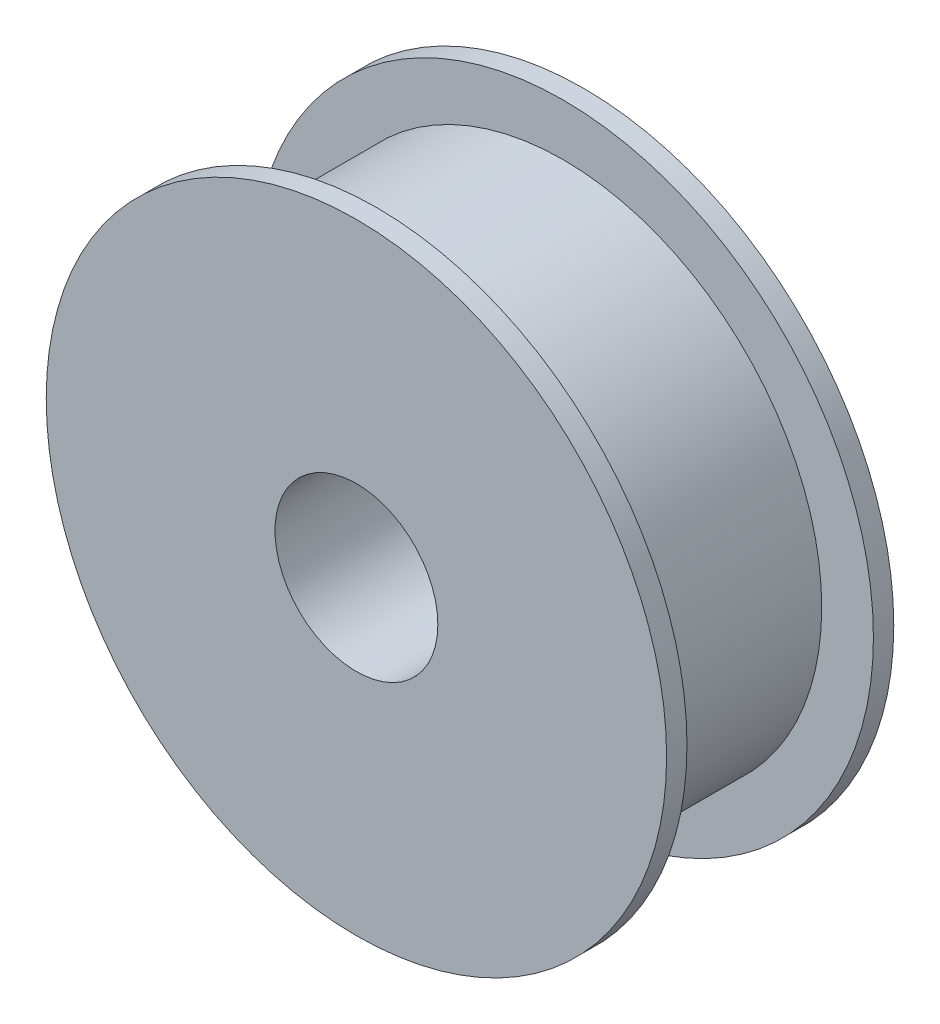
ISO-10303-21;
HEADER;
FILE_DESCRIPTION(('STEP AP214'),'2;1');
FILE_NAME('part.step','',(''),(''),'','','');
FILE_SCHEMA(('AUTOMOTIVE_DESIGN { 1 0 10303 214 1 1 1 1 }'));
ENDSEC;
DATA;
#1=APPLICATION_CONTEXT('core data for automotive mechanical design processes');
#2=APPLICATION_PROTOCOL_DEFINITION('international standard','automotive_design',2000,#1);
#3=PRODUCT_CONTEXT('',#1,'mechanical');
#4=PRODUCT('Part','Part','',(#3));
#5=PRODUCT_RELATED_PRODUCT_CATEGORY('part','',(#4));
#6=PRODUCT_DEFINITION_FORMATION('','',#4);
#7=PRODUCT_DEFINITION_CONTEXT('part definition',#1,'design');
#8=PRODUCT_DEFINITION('design','',#6,#7);
#9=PRODUCT_DEFINITION_SHAPE('','',#8);
#10=(LENGTH_UNIT() NAMED_UNIT(*) SI_UNIT(.MILLI.,.METRE.));
#11=(NAMED_UNIT(*) PLANE_ANGLE_UNIT() SI_UNIT($,.RADIAN.));
#12=(NAMED_UNIT(*) SI_UNIT($,.STERADIAN.) SOLID_ANGLE_UNIT());
#13=UNCERTAINTY_MEASURE_WITH_UNIT(LENGTH_MEASURE(1.E-05),#10,'distance_accuracy_value','');
#14=(GEOMETRIC_REPRESENTATION_CONTEXT(3) GLOBAL_UNCERTAINTY_ASSIGNED_CONTEXT((#13)) GLOBAL_UNIT_ASSIGNED_CONTEXT((#10,
#11,#12)) REPRESENTATION_CONTEXT('',''));
#15=CARTESIAN_POINT('',(0.,0.,0.));
#16=DIRECTION('',(0.,0.,1.));
#17=DIRECTION('',(1.,0.,0.));
#18=AXIS2_PLACEMENT_3D('',#15,#16,#17);
#19=CARTESIAN_POINT('',(0.,0.,50.8));
#20=DIRECTION('',(0.,0.,-1.));
#21=DIRECTION('',(-1.,0.,0.));
#22=AXIS2_PLACEMENT_3D('',#19,#20,#21);
#23=CYLINDRICAL_SURFACE('',#22,63.5);
#24=CARTESIAN_POINT('',(0.,0.,50.8));
#25=DIRECTION('',(0.,0.,1.));
#26=DIRECTION('',(1.,0.,0.));
#27=AXIS2_PLACEMENT_3D('',#24,#25,#26);
#28=CIRCLE('',#27,63.5);
#29=CARTESIAN_POINT('',(63.5,0.,50.8));
#30=VERTEX_POINT('',#29);
#31=EDGE_CURVE('E184',#30,#30,#28,.T.);
#32=ORIENTED_EDGE('',*,*,#31,.F.);
#33=EDGE_LOOP('',(#32));
#34=FACE_BOUND('',#33,.T.);
#35=CARTESIAN_POINT('',(0.,0.,5.));
#36=DIRECTION('',(0.,0.,1.));
#37=DIRECTION('',(1.,0.,0.));
#38=AXIS2_PLACEMENT_3D('',#35,#36,#37);
#39=CIRCLE('',#38,63.5);
#40=CARTESIAN_POINT('',(63.5,0.,5.));
#41=VERTEX_POINT('',#40);
#42=EDGE_CURVE('E177',#41,#41,#39,.T.);
#43=ORIENTED_EDGE('',*,*,#42,.T.);
#44=EDGE_LOOP('',(#43));
#45=FACE_BOUND('',#44,.T.);
#46=CARTESIAN_POINT('',(0.,0.,29.884375));
#47=DIRECTION('',(0.,0.,-1.));
#48=DIRECTION('',(-1.,0.,0.));
#49=AXIS2_PLACEMENT_3D('',#46,#47,#48);
#50=CIRCLE('',#49,63.5);
#51=CARTESIAN_POINT('',(-63.4507683168612,-2.5,29.884375));
#52=VERTEX_POINT('',#51);
#53=CARTESIAN_POINT('',(-63.4507683168612,2.5,29.884375));
#54=VERTEX_POINT('',#53);
#55=EDGE_CURVE('E11',#52,#54,#50,.T.);
#56=ORIENTED_EDGE('',*,*,#55,.F.);
#57=DIRECTION('',(0.,0.,-1.));
#58=VECTOR('',#57,1.);
#59=CARTESIAN_POINT('',(-63.4507683168612,-2.5,50.8));
#60=LINE('',#59,#58);
#61=CARTESIAN_POINT('',(-63.4507683168612,-2.5,24.328125));
#62=VERTEX_POINT('',#61);
#63=EDGE_CURVE('E198',#62,#52,#60,.F.);
#64=ORIENTED_EDGE('',*,*,#63,.F.);
#65=CARTESIAN_POINT('',(0.,0.,24.328125));
#66=DIRECTION('',(0.,0.,1.));
#67=DIRECTION('',(1.,0.,0.));
#68=AXIS2_PLACEMENT_3D('',#65,#66,#67);
#69=CIRCLE('',#68,63.5);
#70=CARTESIAN_POINT('',(-63.4507683168612,2.5,24.328125));
#71=VERTEX_POINT('',#70);
#72=EDGE_CURVE('E192',#71,#62,#69,.T.);
#73=ORIENTED_EDGE('',*,*,#72,.F.);
#74=DIRECTION('',(0.,0.,-1.));
#75=VECTOR('',#74,1.);
#76=CARTESIAN_POINT('',(-63.4507683168612,2.5,50.8));
#77=LINE('',#76,#75);
#78=EDGE_CURVE('E47',#71,#54,#77,.F.);
#79=ORIENTED_EDGE('',*,*,#78,.T.);
#80=EDGE_LOOP('',(#56,#64,#73,#79));
#81=FACE_BOUND('',#80,.T.);
#82=ADVANCED_FACE('F39',(#34,#45,#81),#23,.T.);
#83=CARTESIAN_POINT('',(0.,0.,5.));
#84=DIRECTION('',(0.,0.,-1.));
#85=DIRECTION('',(-1.,0.,0.));
#86=AXIS2_PLACEMENT_3D('',#83,#84,#85);
#87=CYLINDRICAL_SURFACE('',#86,5.1);
#88=CARTESIAN_POINT('',(0.,0.,5.));
#89=DIRECTION('',(0.,0.,1.));
#90=DIRECTION('',(1.,0.,0.));
#91=AXIS2_PLACEMENT_3D('',#88,#89,#90);
#92=CIRCLE('',#91,5.1);
#93=CARTESIAN_POINT('',(5.1,0.,5.));
#94=VERTEX_POINT('',#93);
#95=EDGE_CURVE('E168',#94,#94,#92,.T.);
#96=ORIENTED_EDGE('',*,*,#95,.T.);
#97=EDGE_LOOP('',(#96));
#98=FACE_BOUND('',#97,.T.);
#99=CARTESIAN_POINT('',(0.,0.,1.2));
#100=DIRECTION('',(0.,0.,-1.));
#101=DIRECTION('',(-1.,0.,0.));
#102=AXIS2_PLACEMENT_3D('',#99,#100,#101);
#103=CIRCLE('',#102,5.1);
#104=CARTESIAN_POINT('',(-5.1,0.,1.2));
#105=VERTEX_POINT('',#104);
#106=EDGE_CURVE('E136',#105,#105,#103,.T.);
#107=ORIENTED_EDGE('',*,*,#106,.T.);
#108=EDGE_LOOP('',(#107));
#109=FACE_BOUND('',#108,.T.);
#110=ADVANCED_FACE('F233',(#98,#109),#87,.F.);
#111=CARTESIAN_POINT('',(0.,8.,5.));
#112=DIRECTION('',(0.,0.,-1.));
#113=DIRECTION('',(-1.,0.,0.));
#114=AXIS2_PLACEMENT_3D('',#111,#112,#113);
#115=CYLINDRICAL_SURFACE('',#114,1.5);
#116=CARTESIAN_POINT('',(0.,8.,5.));
#117=DIRECTION('',(0.,0.,1.));
#118=DIRECTION('',(1.,0.,0.));
#119=AXIS2_PLACEMENT_3D('',#116,#117,#118);
#120=CIRCLE('',#119,1.5);
#121=CARTESIAN_POINT('',(1.5,8.,5.));
#122=VERTEX_POINT('',#121);
#123=EDGE_CURVE('E164',#122,#122,#120,.T.);
#124=ORIENTED_EDGE('',*,*,#123,.T.);
#125=EDGE_LOOP('',(#124));
#126=FACE_BOUND('',#125,.T.);
#127=CARTESIAN_POINT('',(0.,8.,1.2));
#128=DIRECTION('',(0.,0.,-1.));
#129=DIRECTION('',(-1.,0.,0.));
#130=AXIS2_PLACEMENT_3D('',#127,#128,#129);
#131=CIRCLE('',#130,1.5);
#132=CARTESIAN_POINT('',(-1.5,8.,1.2));
#133=VERTEX_POINT('',#132);
#134=EDGE_CURVE('E132',#133,#133,#131,.T.);
#135=ORIENTED_EDGE('',*,*,#134,.T.);
#136=EDGE_LOOP('',(#135));
#137=FACE_BOUND('',#136,.T.);
#138=ADVANCED_FACE('F238',(#126,#137),#115,.F.);
#139=CARTESIAN_POINT('',(8.00000000000023,2.25904099284255E-13,5.));
#140=DIRECTION('',(0.,0.,-1.));
#141=DIRECTION('',(-1.,0.,0.));
#142=AXIS2_PLACEMENT_3D('',#139,#140,#141);
#143=CYLINDRICAL_SURFACE('',#142,1.50000000000018);
#144=CARTESIAN_POINT('',(8.00000000000023,2.25904099284255E-13,5.));
#145=DIRECTION('',(0.,0.,1.));
#146=DIRECTION('',(1.,0.,0.));
#147=AXIS2_PLACEMENT_3D('',#144,#145,#146);
#148=CIRCLE('',#147,1.50000000000018);
#149=CARTESIAN_POINT('',(9.5000000000004,2.25904099284255E-13,5.));
#150=VERTEX_POINT('',#149);
#151=EDGE_CURVE('E160',#150,#150,#148,.T.);
#152=ORIENTED_EDGE('',*,*,#151,.T.);
#153=EDGE_LOOP('',(#152));
#154=FACE_BOUND('',#153,.T.);
#155=CARTESIAN_POINT('',(8.00000000000023,2.25904099284255E-13,1.2));
#156=DIRECTION('',(0.,0.,-1.));
#157=DIRECTION('',(-1.,0.,0.));
#158=AXIS2_PLACEMENT_3D('',#155,#156,#157);
#159=CIRCLE('',#158,1.50000000000018);
#160=CARTESIAN_POINT('',(6.50000000000005,2.25904099284255E-13,1.2));
#161=VERTEX_POINT('',#160);
#162=EDGE_CURVE('E128',#161,#161,#159,.T.);
#163=ORIENTED_EDGE('',*,*,#162,.T.);
#164=EDGE_LOOP('',(#163));
#165=FACE_BOUND('',#164,.T.);
#166=ADVANCED_FACE('F277',(#154,#165),#143,.F.);
#167=CARTESIAN_POINT('',(4.51808198568511E-13,-8.,5.));
#168=DIRECTION('',(0.,0.,-1.));
#169=DIRECTION('',(-1.,0.,0.));
#170=AXIS2_PLACEMENT_3D('',#167,#168,#169);
#171=CYLINDRICAL_SURFACE('',#170,1.50000000000049);
#172=CARTESIAN_POINT('',(4.51808198568511E-13,-8.,5.));
#173=DIRECTION('',(0.,0.,1.));
#174=DIRECTION('',(1.,0.,0.));
#175=AXIS2_PLACEMENT_3D('',#172,#173,#174);
#176=CIRCLE('',#175,1.50000000000049);
#177=CARTESIAN_POINT('',(1.50000000000094,-8.,5.));
#178=VERTEX_POINT('',#177);
#179=EDGE_CURVE('E156',#178,#178,#176,.T.);
#180=ORIENTED_EDGE('',*,*,#179,.T.);
#181=EDGE_LOOP('',(#180));
#182=FACE_BOUND('',#181,.T.);
#183=CARTESIAN_POINT('',(4.51808198568511E-13,-8.,1.2));
#184=DIRECTION('',(0.,0.,-1.));
#185=DIRECTION('',(-1.,0.,0.));
#186=AXIS2_PLACEMENT_3D('',#183,#184,#185);
#187=CIRCLE('',#186,1.50000000000049);
#188=CARTESIAN_POINT('',(-1.50000000000003,-8.,1.2));
#189=VERTEX_POINT('',#188);
#190=EDGE_CURVE('E124',#189,#189,#187,.T.);
#191=ORIENTED_EDGE('',*,*,#190,.T.);
#192=EDGE_LOOP('',(#191));
#193=FACE_BOUND('',#192,.T.);
#194=ADVANCED_FACE('F281',(#182,#193),#171,.F.);
#195=CARTESIAN_POINT('',(-7.99999999999977,-2.26883816723573E-13,5.));
#196=DIRECTION('',(0.,0.,-1.));
#197=DIRECTION('',(-1.,0.,0.));
#198=AXIS2_PLACEMENT_3D('',#195,#196,#197);
#199=CYLINDRICAL_SURFACE('',#198,1.50000000000036);
#200=CARTESIAN_POINT('',(-7.99999999999977,-2.26883816723573E-13,5.));
#201=DIRECTION('',(0.,0.,1.));
#202=DIRECTION('',(1.,0.,0.));
#203=AXIS2_PLACEMENT_3D('',#200,#201,#202);
#204=CIRCLE('',#203,1.50000000000036);
#205=CARTESIAN_POINT('',(-6.49999999999941,-2.26883816723573E-13,5.));
#206=VERTEX_POINT('',#205);
#207=EDGE_CURVE('E149',#206,#206,#204,.T.);
#208=ORIENTED_EDGE('',*,*,#207,.T.);
#209=EDGE_LOOP('',(#208));
#210=FACE_BOUND('',#209,.T.);
#211=CARTESIAN_POINT('',(-7.99999999999977,-2.26883816723573E-13,1.2));
#212=DIRECTION('',(0.,0.,-1.));
#213=DIRECTION('',(-1.,0.,0.));
#214=AXIS2_PLACEMENT_3D('',#211,#212,#213);
#215=CIRCLE('',#214,1.50000000000036);
#216=CARTESIAN_POINT('',(-9.50000000000014,-2.26883816723573E-13,1.2));
#217=VERTEX_POINT('',#216);
#218=EDGE_CURVE('E120',#217,#217,#215,.T.);
#219=ORIENTED_EDGE('',*,*,#218,.T.);
#220=EDGE_LOOP('',(#219));
#221=FACE_BOUND('',#220,.T.);
#222=ADVANCED_FACE('F272',(#210,#221),#199,.F.);
#223=CARTESIAN_POINT('',(0.,0.,50.8));
#224=DIRECTION('',(0.,0.,-1.));
#225=DIRECTION('',(-1.,0.,0.));
#226=AXIS2_PLACEMENT_3D('',#223,#224,#225);
#227=CYLINDRICAL_SURFACE('',#226,20.);
#228=CARTESIAN_POINT('',(0.,0.,5.));
#229=DIRECTION('',(0.,0.,1.));
#230=DIRECTION('',(1.,0.,0.));
#231=AXIS2_PLACEMENT_3D('',#228,#229,#230);
#232=CIRCLE('',#231,20.);
#233=CARTESIAN_POINT('',(20.,0.,5.));
#234=VERTEX_POINT('',#233);
#235=EDGE_CURVE('E188',#234,#234,#232,.T.);
#236=ORIENTED_EDGE('',*,*,#235,.F.);
#237=EDGE_LOOP('',(#236));
#238=FACE_BOUND('',#237,.T.);
#239=CARTESIAN_POINT('',(0.,0.,55.8));
#240=DIRECTION('',(0.,0.,1.));
#241=DIRECTION('',(1.,0.,0.));
#242=AXIS2_PLACEMENT_3D('',#239,#240,#241);
#243=CIRCLE('',#242,20.);
#244=CARTESIAN_POINT('',(20.,0.,55.8));
#245=VERTEX_POINT('',#244);
#246=EDGE_CURVE('E140',#245,#245,#243,.T.);
#247=ORIENTED_EDGE('',*,*,#246,.T.);
#248=EDGE_LOOP('',(#247));
#249=FACE_BOUND('',#248,.T.);
#250=ADVANCED_FACE('F270',(#238,#249),#227,.F.);
#251=CARTESIAN_POINT('',(0.,0.,5.));
#252=DIRECTION('',(0.,0.,1.));
#253=DIRECTION('',(1.,0.,0.));
#254=AXIS2_PLACEMENT_3D('',#251,#252,#253);
#255=PLANE('',#254);
#256=ORIENTED_EDGE('',*,*,#207,.F.);
#257=EDGE_LOOP('',(#256));
#258=FACE_BOUND('',#257,.T.);
#259=ORIENTED_EDGE('',*,*,#151,.F.);
#260=EDGE_LOOP('',(#259));
#261=FACE_BOUND('',#260,.T.);
#262=ORIENTED_EDGE('',*,*,#95,.F.);
#263=EDGE_LOOP('',(#262));
#264=FACE_BOUND('',#263,.T.);
#265=ORIENTED_EDGE('',*,*,#123,.F.);
#266=EDGE_LOOP('',(#265));
#267=FACE_BOUND('',#266,.T.);
#268=ORIENTED_EDGE('',*,*,#179,.F.);
#269=EDGE_LOOP('',(#268));
#270=FACE_BOUND('',#269,.T.);
#271=ORIENTED_EDGE('',*,*,#235,.T.);
#272=EDGE_LOOP('',(#271));
#273=FACE_BOUND('',#272,.T.);
#274=ADVANCED_FACE('F249',(#258,#261,#264,#267,#270,#273),#255,.T.);
#275=ORIENTED_EDGE('',*,*,#42,.F.);
#276=EDGE_LOOP('',(#275));
#277=FACE_BOUND('',#276,.T.);
#278=CARTESIAN_POINT('',(0.,0.,5.));
#279=DIRECTION('',(0.,0.,1.));
#280=DIRECTION('',(1.,0.,0.));
#281=AXIS2_PLACEMENT_3D('',#278,#279,#280);
#282=CIRCLE('',#281,76.2);
#283=CARTESIAN_POINT('',(76.2,0.,5.));
#284=VERTEX_POINT('',#283);
#285=EDGE_CURVE('E173',#284,#284,#282,.T.);
#286=ORIENTED_EDGE('',*,*,#285,.T.);
#287=EDGE_LOOP('',(#286));
#288=FACE_BOUND('',#287,.T.);
#289=ADVANCED_FACE('F245',(#277,#288),#255,.T.);
#290=CARTESIAN_POINT('',(0.,0.,5.));
#291=DIRECTION('',(0.,0.,-1.));
#292=DIRECTION('',(-1.,0.,0.));
#293=AXIS2_PLACEMENT_3D('',#290,#291,#292);
#294=CYLINDRICAL_SURFACE('',#293,76.2);
#295=ORIENTED_EDGE('',*,*,#285,.F.);
#296=EDGE_LOOP('',(#295));
#297=FACE_BOUND('',#296,.T.);
#298=CARTESIAN_POINT('',(0.,0.,0.));
#299=DIRECTION('',(0.,0.,1.));
#300=DIRECTION('',(1.,0.,0.));
#301=AXIS2_PLACEMENT_3D('',#298,#299,#300);
#302=CIRCLE('',#301,76.2);
#303=CARTESIAN_POINT('',(76.2,0.,0.));
#304=VERTEX_POINT('',#303);
#305=EDGE_CURVE('E172',#304,#304,#302,.T.);
#306=ORIENTED_EDGE('',*,*,#305,.T.);
#307=EDGE_LOOP('',(#306));
#308=FACE_BOUND('',#307,.T.);
#309=ADVANCED_FACE('F248',(#297,#308),#294,.T.);
#310=CARTESIAN_POINT('',(0.,0.,0.));
#311=DIRECTION('',(0.,0.,1.));
#312=DIRECTION('',(1.,0.,0.));
#313=AXIS2_PLACEMENT_3D('',#310,#311,#312);
#314=PLANE('',#313);
#315=CARTESIAN_POINT('',(0.,0.,0.));
#316=DIRECTION('',(0.,0.,-1.));
#317=DIRECTION('',(-1.,0.,0.));
#318=AXIS2_PLACEMENT_3D('',#315,#316,#317);
#319=CIRCLE('',#318,11.1);
#320=CARTESIAN_POINT('',(-11.1,0.,0.));
#321=VERTEX_POINT('',#320);
#322=EDGE_CURVE('E94',#321,#321,#319,.T.);
#323=ORIENTED_EDGE('',*,*,#322,.F.);
#324=EDGE_LOOP('',(#323));
#325=FACE_BOUND('',#324,.T.);
#326=ORIENTED_EDGE('',*,*,#305,.F.);
#327=EDGE_LOOP('',(#326));
#328=FACE_BOUND('',#327,.T.);
#329=ADVANCED_FACE('F255',(#325,#328),#314,.F.);
#330=CARTESIAN_POINT('',(0.,0.,55.8));
#331=DIRECTION('',(0.,0.,1.));
#332=DIRECTION('',(1.,0.,0.));
#333=AXIS2_PLACEMENT_3D('',#330,#331,#332);
#334=PLANE('',#333);
#335=CARTESIAN_POINT('',(0.,0.,55.8));
#336=DIRECTION('',(0.,0.,1.));
#337=DIRECTION('',(1.,0.,0.));
#338=AXIS2_PLACEMENT_3D('',#335,#336,#337);
#339=CIRCLE('',#338,76.2);
#340=CARTESIAN_POINT('',(76.2,0.,55.8));
#341=VERTEX_POINT('',#340);
#342=EDGE_CURVE('E145',#341,#341,#339,.T.);
#343=ORIENTED_EDGE('',*,*,#342,.T.);
#344=EDGE_LOOP('',(#343));
#345=FACE_BOUND('',#344,.T.);
#346=ORIENTED_EDGE('',*,*,#246,.F.);
#347=EDGE_LOOP('',(#346));
#348=FACE_BOUND('',#347,.T.);
#349=ADVANCED_FACE('F260',(#345,#348),#334,.T.);
#350=CARTESIAN_POINT('',(0.,0.,50.8));
#351=DIRECTION('',(0.,0.,1.));
#352=DIRECTION('',(1.,0.,0.));
#353=AXIS2_PLACEMENT_3D('',#350,#351,#352);
#354=PLANE('',#353);
#355=ORIENTED_EDGE('',*,*,#31,.T.);
#356=EDGE_LOOP('',(#355));
#357=FACE_BOUND('',#356,.T.);
#358=CARTESIAN_POINT('',(0.,0.,50.8));
#359=DIRECTION('',(0.,0.,1.));
#360=DIRECTION('',(1.,0.,0.));
#361=AXIS2_PLACEMENT_3D('',#358,#359,#360);
#362=CIRCLE('',#361,76.2);
#363=CARTESIAN_POINT('',(76.2,0.,50.8));
#364=VERTEX_POINT('',#363);
#365=EDGE_CURVE('E144',#364,#364,#362,.T.);
#366=ORIENTED_EDGE('',*,*,#365,.F.);
#367=EDGE_LOOP('',(#366));
#368=FACE_BOUND('',#367,.T.);
#369=ADVANCED_FACE('F265',(#357,#368),#354,.F.);
#370=CARTESIAN_POINT('',(0.,0.,55.8));
#371=DIRECTION('',(0.,0.,-1.));
#372=DIRECTION('',(-1.,0.,0.));
#373=AXIS2_PLACEMENT_3D('',#370,#371,#372);
#374=CYLINDRICAL_SURFACE('',#373,76.2);
#375=ORIENTED_EDGE('',*,*,#342,.F.);
#376=EDGE_LOOP('',(#375));
#377=FACE_BOUND('',#376,.T.);
#378=ORIENTED_EDGE('',*,*,#365,.T.);
#379=EDGE_LOOP('',(#378));
#380=FACE_BOUND('',#379,.T.);
#381=ADVANCED_FACE('F289',(#377,#380),#374,.T.);
#382=CARTESIAN_POINT('',(0.,0.,1.2));
#383=DIRECTION('',(0.,0.,-1.));
#384=DIRECTION('',(-1.,0.,0.));
#385=AXIS2_PLACEMENT_3D('',#382,#383,#384);
#386=CYLINDRICAL_SURFACE('',#385,11.1);
#387=CARTESIAN_POINT('',(0.,0.,1.2));
#388=DIRECTION('',(0.,0.,-1.));
#389=DIRECTION('',(-1.,0.,0.));
#390=AXIS2_PLACEMENT_3D('',#387,#388,#389);
#391=CIRCLE('',#390,11.1);
#392=CARTESIAN_POINT('',(-11.1,0.,1.2));
#393=VERTEX_POINT('',#392);
#394=EDGE_CURVE('E116',#393,#393,#391,.T.);
#395=ORIENTED_EDGE('',*,*,#394,.F.);
#396=EDGE_LOOP('',(#395));
#397=FACE_BOUND('',#396,.T.);
#398=ORIENTED_EDGE('',*,*,#322,.T.);
#399=EDGE_LOOP('',(#398));
#400=FACE_BOUND('',#399,.T.);
#401=ADVANCED_FACE('F228',(#397,#400),#386,.F.);
#402=CARTESIAN_POINT('',(0.,0.,1.2));
#403=DIRECTION('',(0.,0.,-1.));
#404=DIRECTION('',(-1.,0.,0.));
#405=AXIS2_PLACEMENT_3D('',#402,#403,#404);
#406=PLANE('',#405);
#407=ORIENTED_EDGE('',*,*,#106,.F.);
#408=EDGE_LOOP('',(#407));
#409=FACE_BOUND('',#408,.T.);
#410=ORIENTED_EDGE('',*,*,#134,.F.);
#411=EDGE_LOOP('',(#410));
#412=FACE_BOUND('',#411,.T.);
#413=ORIENTED_EDGE('',*,*,#162,.F.);
#414=EDGE_LOOP('',(#413));
#415=FACE_BOUND('',#414,.T.);
#416=ORIENTED_EDGE('',*,*,#190,.F.);
#417=EDGE_LOOP('',(#416));
#418=FACE_BOUND('',#417,.T.);
#419=ORIENTED_EDGE('',*,*,#218,.F.);
#420=EDGE_LOOP('',(#419));
#421=FACE_BOUND('',#420,.T.);
#422=ORIENTED_EDGE('',*,*,#394,.T.);
#423=EDGE_LOOP('',(#422));
#424=FACE_BOUND('',#423,.T.);
#425=ADVANCED_FACE('F220',(#409,#412,#415,#418,#421,#424),#406,.T.);
#426=CARTESIAN_POINT('',(-67.3367434647998,2.5,27.10625));
#427=DIRECTION('',(0.,1.,0.));
#428=DIRECTION('',(0.,0.,1.));
#429=AXIS2_PLACEMENT_3D('',#426,#427,#428);
#430=PLANE('',#429);
#431=CARTESIAN_POINT('',(-67.3367434647998,2.5,27.10625));
#432=DIRECTION('',(0.,1.,0.));
#433=DIRECTION('',(0.,0.,1.));
#434=AXIS2_PLACEMENT_3D('',#431,#432,#433);
#435=CIRCLE('',#434,1.5875);
#436=CARTESIAN_POINT('',(-67.3367434647998,2.5,28.69375));
#437=VERTEX_POINT('',#436);
#438=EDGE_CURVE('E110',#437,#437,#435,.T.);
#439=ORIENTED_EDGE('',*,*,#438,.F.);
#440=EDGE_LOOP('',(#439));
#441=FACE_BOUND('',#440,.T.);
#442=ORIENTED_EDGE('',*,*,#78,.F.);
#443=DIRECTION('',(-1.,0.,0.));
#444=VECTOR('',#443,1.);
#445=CARTESIAN_POINT('',(-59.6632565352002,2.5,24.328125));
#446=LINE('',#445,#444);
#447=CARTESIAN_POINT('',(-67.3367434647998,2.5,24.328125));
#448=VERTEX_POINT('',#447);
#449=EDGE_CURVE('E74',#71,#448,#446,.T.);
#450=ORIENTED_EDGE('',*,*,#449,.T.);
#451=CARTESIAN_POINT('',(-67.3367434647998,2.5,27.10625));
#452=DIRECTION('',(0.,1.,0.));
#453=DIRECTION('',(0.,0.,1.));
#454=AXIS2_PLACEMENT_3D('',#451,#452,#453);
#455=CIRCLE('',#454,2.778125);
#456=CARTESIAN_POINT('',(-67.3367434647998,2.5,29.884375));
#457=VERTEX_POINT('',#456);
#458=EDGE_CURVE('E79',#448,#457,#455,.T.);
#459=ORIENTED_EDGE('',*,*,#458,.T.);
#460=DIRECTION('',(1.,0.,0.));
#461=VECTOR('',#460,1.);
#462=CARTESIAN_POINT('',(-59.6632565352002,2.5,29.884375));
#463=LINE('',#462,#461);
#464=EDGE_CURVE('E84',#457,#54,#463,.T.);
#465=ORIENTED_EDGE('',*,*,#464,.T.);
#466=EDGE_LOOP('',(#442,#450,#459,#465));
#467=FACE_BOUND('',#466,.T.);
#468=ADVANCED_FACE('F76',(#441,#467),#430,.T.);
#469=CARTESIAN_POINT('',(-67.3367434647998,-2.5,27.10625));
#470=DIRECTION('',(0.,1.,0.));
#471=DIRECTION('',(0.,0.,1.));
#472=AXIS2_PLACEMENT_3D('',#469,#470,#471);
#473=PLANE('',#472);
#474=CARTESIAN_POINT('',(-67.3367434647998,-2.5,27.10625));
#475=DIRECTION('',(0.,1.,0.));
#476=DIRECTION('',(0.,0.,1.));
#477=AXIS2_PLACEMENT_3D('',#474,#475,#476);
#478=CIRCLE('',#477,1.5875);
#479=CARTESIAN_POINT('',(-67.3367434647998,-2.5,28.69375));
#480=VERTEX_POINT('',#479);
#481=EDGE_CURVE('E208',#480,#480,#478,.T.);
#482=ORIENTED_EDGE('',*,*,#481,.T.);
#483=EDGE_LOOP('',(#482));
#484=FACE_BOUND('',#483,.T.);
#485=DIRECTION('',(-1.,0.,0.));
#486=VECTOR('',#485,1.);
#487=CARTESIAN_POINT('',(-59.6632565352002,-2.5,24.328125));
#488=LINE('',#487,#486);
#489=CARTESIAN_POINT('',(-67.3367434647998,-2.5,24.328125));
#490=VERTEX_POINT('',#489);
#491=EDGE_CURVE('E90',#62,#490,#488,.T.);
#492=ORIENTED_EDGE('',*,*,#491,.F.);
#493=ORIENTED_EDGE('',*,*,#63,.T.);
#494=DIRECTION('',(1.,0.,0.));
#495=VECTOR('',#494,1.);
#496=CARTESIAN_POINT('',(-59.6632565352002,-2.5,29.884375));
#497=LINE('',#496,#495);
#498=CARTESIAN_POINT('',(-67.3367434647998,-2.5,29.884375));
#499=VERTEX_POINT('',#498);
#500=EDGE_CURVE('E106',#499,#52,#497,.T.);
#501=ORIENTED_EDGE('',*,*,#500,.F.);
#502=CARTESIAN_POINT('',(-67.3367434647998,-2.5,27.10625));
#503=DIRECTION('',(0.,1.,0.));
#504=DIRECTION('',(0.,0.,1.));
#505=AXIS2_PLACEMENT_3D('',#502,#503,#504);
#506=CIRCLE('',#505,2.778125);
#507=EDGE_CURVE('E113',#490,#499,#506,.T.);
#508=ORIENTED_EDGE('',*,*,#507,.F.);
#509=EDGE_LOOP('',(#492,#493,#501,#508));
#510=FACE_BOUND('',#509,.T.);
#511=ADVANCED_FACE('F203',(#484,#510),#473,.F.);
#512=CARTESIAN_POINT('',(-59.6632565352002,2.5,29.884375));
#513=DIRECTION('',(0.,0.,-1.));
#514=DIRECTION('',(-1.,0.,0.));
#515=AXIS2_PLACEMENT_3D('',#512,#513,#514);
#516=PLANE('',#515);
#517=ORIENTED_EDGE('',*,*,#500,.T.);
#518=ORIENTED_EDGE('',*,*,#55,.T.);
#519=ORIENTED_EDGE('',*,*,#464,.F.);
#520=DIRECTION('',(0.,-1.,0.));
#521=VECTOR('',#520,1.);
#522=CARTESIAN_POINT('',(-67.3367434647998,2.5,29.884375));
#523=LINE('',#522,#521);
#524=EDGE_CURVE('E95',#457,#499,#523,.T.);
#525=ORIENTED_EDGE('',*,*,#524,.T.);
#526=EDGE_LOOP('',(#517,#518,#519,#525));
#527=FACE_BOUND('',#526,.T.);
#528=ADVANCED_FACE('F205',(#527),#516,.F.);
#529=CARTESIAN_POINT('',(-59.6632565352002,2.5,24.328125));
#530=DIRECTION('',(0.,0.,1.));
#531=DIRECTION('',(1.,0.,0.));
#532=AXIS2_PLACEMENT_3D('',#529,#530,#531);
#533=PLANE('',#532);
#534=ORIENTED_EDGE('',*,*,#449,.F.);
#535=ORIENTED_EDGE('',*,*,#72,.T.);
#536=ORIENTED_EDGE('',*,*,#491,.T.);
#537=DIRECTION('',(0.,-1.,0.));
#538=VECTOR('',#537,1.);
#539=CARTESIAN_POINT('',(-67.3367434647998,2.5,24.328125));
#540=LINE('',#539,#538);
#541=EDGE_CURVE('E87',#448,#490,#540,.T.);
#542=ORIENTED_EDGE('',*,*,#541,.F.);
#543=EDGE_LOOP('',(#534,#535,#536,#542));
#544=FACE_BOUND('',#543,.T.);
#545=ADVANCED_FACE('F88',(#544),#533,.F.);
#546=CARTESIAN_POINT('',(-67.3367434647998,2.5,27.10625));
#547=DIRECTION('',(0.,-1.,0.));
#548=DIRECTION('',(0.,0.,-1.));
#549=AXIS2_PLACEMENT_3D('',#546,#547,#548);
#550=CYLINDRICAL_SURFACE('',#549,2.778125);
#551=ORIENTED_EDGE('',*,*,#507,.T.);
#552=ORIENTED_EDGE('',*,*,#524,.F.);
#553=ORIENTED_EDGE('',*,*,#458,.F.);
#554=ORIENTED_EDGE('',*,*,#541,.T.);
#555=EDGE_LOOP('',(#551,#552,#553,#554));
#556=FACE_BOUND('',#555,.T.);
#557=ADVANCED_FACE('F97',(#556),#550,.T.);
#558=CARTESIAN_POINT('',(-67.3367434647998,2.5,27.10625));
#559=DIRECTION('',(0.,-1.,0.));
#560=DIRECTION('',(0.,0.,-1.));
#561=AXIS2_PLACEMENT_3D('',#558,#559,#560);
#562=CYLINDRICAL_SURFACE('',#561,1.5875);
#563=ORIENTED_EDGE('',*,*,#438,.T.);
#564=EDGE_LOOP('',(#563));
#565=FACE_BOUND('',#564,.T.);
#566=ORIENTED_EDGE('',*,*,#481,.F.);
#567=EDGE_LOOP('',(#566));
#568=FACE_BOUND('',#567,.T.);
#569=ADVANCED_FACE('F216',(#565,#568),#562,.F.);
#570=CLOSED_SHELL('',(#82,#110,#138,#166,#194,#222,#250,#274,#289,#309,#329,#349,#369,#381,#401,
#425,#468,#511,#528,#545,#557,#569));
#571=MANIFOLD_SOLID_BREP('B2',#570);
#572=ADVANCED_BREP_SHAPE_REPRESENTATION('',(#18,#571),#14);
#573=SHAPE_DEFINITION_REPRESENTATION(#9,#572);
ENDSEC;
END-ISO-10303-21;
